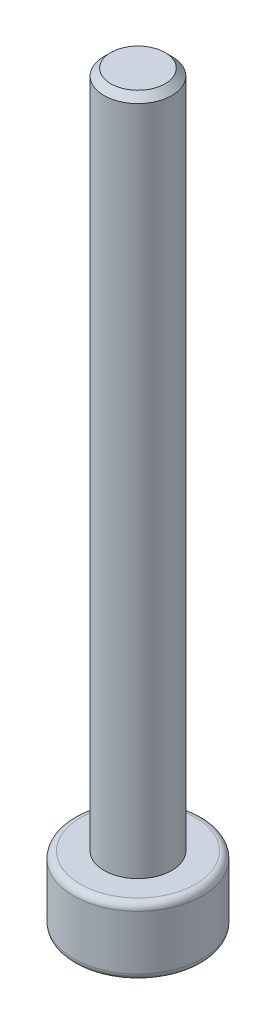
ISO-10303-21;
HEADER;
FILE_DESCRIPTION(('STEP AP214'),'2;1');
FILE_NAME('part.step','',(''),(''),'','','');
FILE_SCHEMA(('AUTOMOTIVE_DESIGN { 1 0 10303 214 1 1 1 1 }'));
ENDSEC;
DATA;
#1=APPLICATION_CONTEXT('core data for automotive mechanical design processes');
#2=APPLICATION_PROTOCOL_DEFINITION('international standard','automotive_design',2000,#1);
#3=PRODUCT_CONTEXT('',#1,'mechanical');
#4=PRODUCT('Part','Part','',(#3));
#5=PRODUCT_RELATED_PRODUCT_CATEGORY('part','',(#4));
#6=PRODUCT_DEFINITION_FORMATION('','',#4);
#7=PRODUCT_DEFINITION_CONTEXT('part definition',#1,'design');
#8=PRODUCT_DEFINITION('design','',#6,#7);
#9=PRODUCT_DEFINITION_SHAPE('','',#8);
#10=(LENGTH_UNIT() NAMED_UNIT(*) SI_UNIT(.MILLI.,.METRE.));
#11=(NAMED_UNIT(*) PLANE_ANGLE_UNIT() SI_UNIT($,.RADIAN.));
#12=(NAMED_UNIT(*) SI_UNIT($,.STERADIAN.) SOLID_ANGLE_UNIT());
#13=UNCERTAINTY_MEASURE_WITH_UNIT(LENGTH_MEASURE(1.E-05),#10,'distance_accuracy_value','');
#14=(GEOMETRIC_REPRESENTATION_CONTEXT(3) GLOBAL_UNCERTAINTY_ASSIGNED_CONTEXT((#13)) GLOBAL_UNIT_ASSIGNED_CONTEXT((#10,
#11,#12)) REPRESENTATION_CONTEXT('',''));
#15=CARTESIAN_POINT('',(0.,0.,0.));
#16=DIRECTION('',(0.,0.,1.));
#17=DIRECTION('',(1.,0.,0.));
#18=AXIS2_PLACEMENT_3D('',#15,#16,#17);
#19=CARTESIAN_POINT('',(0.,3.,0.));
#20=DIRECTION('',(0.,-1.,0.));
#21=DIRECTION('',(0.,0.,-1.));
#22=AXIS2_PLACEMENT_3D('',#19,#20,#21);
#23=CYLINDRICAL_SURFACE('',#22,2.85);
#24=CARTESIAN_POINT('',(0.,2.7,0.));
#25=DIRECTION('',(0.,1.,0.));
#26=DIRECTION('',(0.,0.,1.));
#27=AXIS2_PLACEMENT_3D('',#24,#25,#26);
#28=CIRCLE('',#27,2.85);
#29=CARTESIAN_POINT('',(0.,2.7,2.85));
#30=VERTEX_POINT('',#29);
#31=EDGE_CURVE('E68',#30,#30,#28,.F.);
#32=ORIENTED_EDGE('',*,*,#31,.T.);
#33=EDGE_LOOP('',(#32));
#34=FACE_BOUND('',#33,.T.);
#35=CARTESIAN_POINT('',(0.,0.3,0.));
#36=DIRECTION('',(0.,1.,0.));
#37=DIRECTION('',(0.,0.,1.));
#38=AXIS2_PLACEMENT_3D('',#35,#36,#37);
#39=CIRCLE('',#38,2.85);
#40=CARTESIAN_POINT('',(0.,0.3,2.85));
#41=VERTEX_POINT('',#40);
#42=EDGE_CURVE('E72',#41,#41,#39,.T.);
#43=ORIENTED_EDGE('',*,*,#42,.T.);
#44=EDGE_LOOP('',(#43));
#45=FACE_BOUND('',#44,.T.);
#46=ADVANCED_FACE('F39',(#34,#45),#23,.T.);
#47=CARTESIAN_POINT('',(0.,3.,0.));
#48=DIRECTION('',(0.,1.,0.));
#49=DIRECTION('',(0.,0.,1.));
#50=AXIS2_PLACEMENT_3D('',#47,#48,#49);
#51=PLANE('',#50);
#52=CARTESIAN_POINT('',(0.,3.,0.));
#53=DIRECTION('',(0.,1.,0.));
#54=DIRECTION('',(0.,0.,1.));
#55=AXIS2_PLACEMENT_3D('',#52,#53,#54);
#56=CIRCLE('',#55,2.55);
#57=CARTESIAN_POINT('',(0.,3.,2.55));
#58=VERTEX_POINT('',#57);
#59=EDGE_CURVE('E76',#58,#58,#56,.T.);
#60=ORIENTED_EDGE('',*,*,#59,.T.);
#61=EDGE_LOOP('',(#60));
#62=FACE_BOUND('',#61,.T.);
#63=CARTESIAN_POINT('',(0.,3.,0.));
#64=DIRECTION('',(0.,1.,0.));
#65=DIRECTION('',(0.,0.,1.));
#66=AXIS2_PLACEMENT_3D('',#63,#64,#65);
#67=CIRCLE('',#66,1.5);
#68=CARTESIAN_POINT('',(0.,3.,1.5));
#69=VERTEX_POINT('',#68);
#70=EDGE_CURVE('E80',#69,#69,#67,.T.);
#71=ORIENTED_EDGE('',*,*,#70,.F.);
#72=EDGE_LOOP('',(#71));
#73=FACE_BOUND('',#72,.T.);
#74=ADVANCED_FACE('F105',(#62,#73),#51,.T.);
#75=CARTESIAN_POINT('',(0.,0.,0.));
#76=DIRECTION('',(0.,1.,0.));
#77=DIRECTION('',(0.,0.,1.));
#78=AXIS2_PLACEMENT_3D('',#75,#76,#77);
#79=PLANE('',#78);
#80=CARTESIAN_POINT('',(0.,0.,0.));
#81=DIRECTION('',(0.,1.,0.));
#82=DIRECTION('',(0.,0.,1.));
#83=AXIS2_PLACEMENT_3D('',#80,#81,#82);
#84=CIRCLE('',#83,1.44000000000001);
#85=CARTESIAN_POINT('',(0.,0.,1.44000000000001));
#86=VERTEX_POINT('',#85);
#87=EDGE_CURVE('E10',#86,#86,#84,.T.);
#88=ORIENTED_EDGE('',*,*,#87,.T.);
#89=EDGE_LOOP('',(#88));
#90=FACE_BOUND('',#89,.T.);
#91=CARTESIAN_POINT('',(0.,0.,0.));
#92=DIRECTION('',(0.,1.,0.));
#93=DIRECTION('',(0.,0.,1.));
#94=AXIS2_PLACEMENT_3D('',#91,#92,#93);
#95=CIRCLE('',#94,2.55);
#96=CARTESIAN_POINT('',(0.,0.,2.55));
#97=VERTEX_POINT('',#96);
#98=EDGE_CURVE('E64',#97,#97,#95,.F.);
#99=ORIENTED_EDGE('',*,*,#98,.T.);
#100=EDGE_LOOP('',(#99));
#101=FACE_BOUND('',#100,.T.);
#102=ADVANCED_FACE('F111',(#90,#101),#79,.F.);
#103=CARTESIAN_POINT('',(0.,33.,0.));
#104=DIRECTION('',(0.,-1.,0.));
#105=DIRECTION('',(0.,0.,-1.));
#106=AXIS2_PLACEMENT_3D('',#103,#104,#105);
#107=CYLINDRICAL_SURFACE('',#106,1.5);
#108=CARTESIAN_POINT('',(0.,32.7,0.));
#109=DIRECTION('',(0.,1.,0.));
#110=DIRECTION('',(0.,0.,1.));
#111=AXIS2_PLACEMENT_3D('',#108,#109,#110);
#112=CIRCLE('',#111,1.5);
#113=CARTESIAN_POINT('',(0.,32.7,1.5));
#114=VERTEX_POINT('',#113);
#115=EDGE_CURVE('E53',#114,#114,#112,.F.);
#116=ORIENTED_EDGE('',*,*,#115,.T.);
#117=EDGE_LOOP('',(#116));
#118=FACE_BOUND('',#117,.T.);
#119=ORIENTED_EDGE('',*,*,#70,.T.);
#120=EDGE_LOOP('',(#119));
#121=FACE_BOUND('',#120,.T.);
#122=ADVANCED_FACE('F101',(#118,#121),#107,.T.);
#123=CARTESIAN_POINT('',(0.,33.,0.));
#124=DIRECTION('',(0.,1.,0.));
#125=DIRECTION('',(0.,0.,1.));
#126=AXIS2_PLACEMENT_3D('',#123,#124,#125);
#127=PLANE('',#126);
#128=CARTESIAN_POINT('',(0.,33.,0.));
#129=DIRECTION('',(0.,1.,0.));
#130=DIRECTION('',(0.,0.,1.));
#131=AXIS2_PLACEMENT_3D('',#128,#129,#130);
#132=CIRCLE('',#131,1.19999999999999);
#133=CARTESIAN_POINT('',(0.,33.,1.19999999999999));
#134=VERTEX_POINT('',#133);
#135=EDGE_CURVE('E58',#134,#134,#132,.T.);
#136=ORIENTED_EDGE('',*,*,#135,.T.);
#137=EDGE_LOOP('',(#136));
#138=FACE_BOUND('',#137,.T.);
#139=ADVANCED_FACE('F93',(#138),#127,.T.);
#140=CARTESIAN_POINT('',(0.,1.3,0.));
#141=DIRECTION('',(0.,-1.,0.));
#142=DIRECTION('',(0.,0.,-1.));
#143=AXIS2_PLACEMENT_3D('',#140,#141,#142);
#144=CYLINDRICAL_SURFACE('',#143,1.29);
#145=CARTESIAN_POINT('',(0.,0.150000000000001,0.));
#146=DIRECTION('',(0.,1.,0.));
#147=DIRECTION('',(0.,0.,1.));
#148=AXIS2_PLACEMENT_3D('',#145,#146,#147);
#149=CIRCLE('',#148,1.29);
#150=CARTESIAN_POINT('',(0.,0.150000000000001,1.29));
#151=VERTEX_POINT('',#150);
#152=EDGE_CURVE('E48',#151,#151,#149,.F.);
#153=ORIENTED_EDGE('',*,*,#152,.T.);
#154=EDGE_LOOP('',(#153));
#155=FACE_BOUND('',#154,.T.);
#156=CARTESIAN_POINT('',(0.,1.3,0.));
#157=DIRECTION('',(0.,-1.,0.));
#158=DIRECTION('',(0.,0.,-1.));
#159=AXIS2_PLACEMENT_3D('',#156,#157,#158);
#160=CIRCLE('',#159,1.29);
#161=CARTESIAN_POINT('',(0.,1.3,-1.29));
#162=VERTEX_POINT('',#161);
#163=EDGE_CURVE('E84',#162,#162,#160,.T.);
#164=ORIENTED_EDGE('',*,*,#163,.F.);
#165=EDGE_LOOP('',(#164));
#166=FACE_BOUND('',#165,.T.);
#167=ADVANCED_FACE('F91',(#155,#166),#144,.F.);
#168=CARTESIAN_POINT('',(0.,1.3,0.));
#169=DIRECTION('',(0.,-1.,0.));
#170=DIRECTION('',(0.,0.,-1.));
#171=AXIS2_PLACEMENT_3D('',#168,#169,#170);
#172=PLANE('',#171);
#173=ORIENTED_EDGE('',*,*,#163,.T.);
#174=EDGE_LOOP('',(#173));
#175=FACE_BOUND('',#174,.T.);
#176=ADVANCED_FACE('F89',(#175),#172,.T.);
#177=CARTESIAN_POINT('',(0.,2.7,0.));
#178=DIRECTION('',(0.,1.,0.));
#179=DIRECTION('',(0.,0.,1.));
#180=AXIS2_PLACEMENT_3D('',#177,#178,#179);
#181=TOROIDAL_SURFACE('',#180,2.55,0.3);
#182=ORIENTED_EDGE('',*,*,#31,.F.);
#183=EDGE_LOOP('',(#182));
#184=FACE_BOUND('',#183,.T.);
#185=ORIENTED_EDGE('',*,*,#59,.F.);
#186=EDGE_LOOP('',(#185));
#187=FACE_BOUND('',#186,.T.);
#188=ADVANCED_FACE('F99',(#184,#187),#181,.T.);
#189=CARTESIAN_POINT('',(0.,0.3,0.));
#190=DIRECTION('',(0.,1.,0.));
#191=DIRECTION('',(0.,0.,1.));
#192=AXIS2_PLACEMENT_3D('',#189,#190,#191);
#193=TOROIDAL_SURFACE('',#192,2.55,0.3);
#194=ORIENTED_EDGE('',*,*,#98,.F.);
#195=EDGE_LOOP('',(#194));
#196=FACE_BOUND('',#195,.T.);
#197=ORIENTED_EDGE('',*,*,#42,.F.);
#198=EDGE_LOOP('',(#197));
#199=FACE_BOUND('',#198,.T.);
#200=ADVANCED_FACE('F119',(#196,#199),#193,.T.);
#201=CARTESIAN_POINT('',(0.,33.,0.));
#202=DIRECTION('',(0.,-1.,0.));
#203=DIRECTION('',(0.,0.,-1.));
#204=AXIS2_PLACEMENT_3D('',#201,#202,#203);
#205=CONICAL_SURFACE('',#204,1.19999999999999,0.785398163397441);
#206=ORIENTED_EDGE('',*,*,#115,.F.);
#207=EDGE_LOOP('',(#206));
#208=FACE_BOUND('',#207,.T.);
#209=ORIENTED_EDGE('',*,*,#135,.F.);
#210=EDGE_LOOP('',(#209));
#211=FACE_BOUND('',#210,.T.);
#212=ADVANCED_FACE('F122',(#208,#211),#205,.T.);
#213=CARTESIAN_POINT('',(0.,0.150000000000001,0.));
#214=DIRECTION('',(0.,-1.,0.));
#215=DIRECTION('',(0.,0.,-1.));
#216=AXIS2_PLACEMENT_3D('',#213,#214,#215);
#217=CONICAL_SURFACE('',#216,1.29,0.785398163397468);
#218=ORIENTED_EDGE('',*,*,#87,.F.);
#219=EDGE_LOOP('',(#218));
#220=FACE_BOUND('',#219,.T.);
#221=ORIENTED_EDGE('',*,*,#152,.F.);
#222=EDGE_LOOP('',(#221));
#223=FACE_BOUND('',#222,.T.);
#224=ADVANCED_FACE('F42',(#220,#223),#217,.F.);
#225=CLOSED_SHELL('',(#46,#74,#102,#122,#139,#167,#176,#188,#200,#212,#224));
#226=MANIFOLD_SOLID_BREP('B2',#225);
#227=ADVANCED_BREP_SHAPE_REPRESENTATION('',(#18,#226),#14);
#228=SHAPE_DEFINITION_REPRESENTATION(#9,#227);
ENDSEC;
END-ISO-10303-21;
